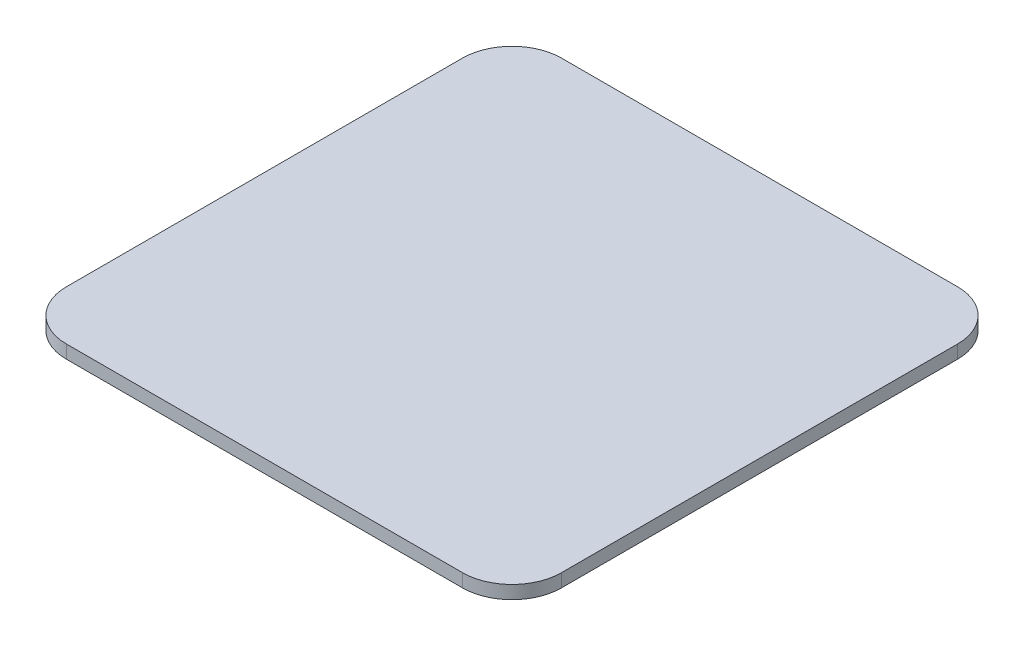
ISO-10303-21;
HEADER;
FILE_DESCRIPTION(('STEP AP214'),'2;1');
FILE_NAME('part.step','',(''),(''),'','','');
FILE_SCHEMA(('AUTOMOTIVE_DESIGN { 1 0 10303 214 1 1 1 1 }'));
ENDSEC;
DATA;
#1=APPLICATION_CONTEXT('core data for automotive mechanical design processes');
#2=APPLICATION_PROTOCOL_DEFINITION('international standard','automotive_design',2000,#1);
#3=PRODUCT_CONTEXT('',#1,'mechanical');
#4=PRODUCT('Part','Part','',(#3));
#5=PRODUCT_RELATED_PRODUCT_CATEGORY('part','',(#4));
#6=PRODUCT_DEFINITION_FORMATION('','',#4);
#7=PRODUCT_DEFINITION_CONTEXT('part definition',#1,'design');
#8=PRODUCT_DEFINITION('design','',#6,#7);
#9=PRODUCT_DEFINITION_SHAPE('','',#8);
#10=(LENGTH_UNIT() NAMED_UNIT(*) SI_UNIT(.MILLI.,.METRE.));
#11=(NAMED_UNIT(*) PLANE_ANGLE_UNIT() SI_UNIT($,.RADIAN.));
#12=(NAMED_UNIT(*) SI_UNIT($,.STERADIAN.) SOLID_ANGLE_UNIT());
#13=UNCERTAINTY_MEASURE_WITH_UNIT(LENGTH_MEASURE(1.E-05),#10,'distance_accuracy_value','');
#14=(GEOMETRIC_REPRESENTATION_CONTEXT(3) GLOBAL_UNCERTAINTY_ASSIGNED_CONTEXT((#13)) GLOBAL_UNIT_ASSIGNED_CONTEXT((#10,
#11,#12)) REPRESENTATION_CONTEXT('',''));
#15=CARTESIAN_POINT('',(0.,0.,0.));
#16=DIRECTION('',(0.,0.,1.));
#17=DIRECTION('',(1.,0.,0.));
#18=AXIS2_PLACEMENT_3D('',#15,#16,#17);
#19=CARTESIAN_POINT('',(75.,4.,0.));
#20=DIRECTION('',(-1.,0.,0.));
#21=DIRECTION('',(0.,0.,1.));
#22=AXIS2_PLACEMENT_3D('',#19,#20,#21);
#23=PLANE('',#22);
#24=DIRECTION('',(0.,0.,-1.));
#25=VECTOR('',#24,1.);
#26=CARTESIAN_POINT('',(75.,0.,0.));
#27=LINE('',#26,#25);
#28=CARTESIAN_POINT('',(75.,0.,60.));
#29=VERTEX_POINT('',#28);
#30=CARTESIAN_POINT('',(75.,0.,-60.));
#31=VERTEX_POINT('',#30);
#32=EDGE_CURVE('E147',#29,#31,#27,.T.);
#33=ORIENTED_EDGE('',*,*,#32,.T.);
#34=DIRECTION('',(0.,-1.,0.));
#35=VECTOR('',#34,1.);
#36=CARTESIAN_POINT('',(75.,4.,-60.));
#37=LINE('',#36,#35);
#38=CARTESIAN_POINT('',(75.,4.,-60.));
#39=VERTEX_POINT('',#38);
#40=EDGE_CURVE('E11',#39,#31,#37,.T.);
#41=ORIENTED_EDGE('',*,*,#40,.F.);
#42=DIRECTION('',(0.,0.,-1.));
#43=VECTOR('',#42,1.);
#44=CARTESIAN_POINT('',(75.,4.,0.));
#45=LINE('',#44,#43);
#46=CARTESIAN_POINT('',(75.,4.,60.));
#47=VERTEX_POINT('',#46);
#48=EDGE_CURVE('E175',#47,#39,#45,.T.);
#49=ORIENTED_EDGE('',*,*,#48,.F.);
#50=DIRECTION('',(0.,-1.,0.));
#51=VECTOR('',#50,1.);
#52=CARTESIAN_POINT('',(75.,4.,60.));
#53=LINE('',#52,#51);
#54=EDGE_CURVE('E62',#47,#29,#53,.T.);
#55=ORIENTED_EDGE('',*,*,#54,.T.);
#56=EDGE_LOOP('',(#33,#41,#49,#55));
#57=FACE_BOUND('',#56,.T.);
#58=ADVANCED_FACE('F45',(#57),#23,.F.);
#59=CARTESIAN_POINT('',(60.,4.,-60.));
#60=DIRECTION('',(0.,-1.,0.));
#61=DIRECTION('',(0.,0.,-1.));
#62=AXIS2_PLACEMENT_3D('',#59,#60,#61);
#63=CYLINDRICAL_SURFACE('',#62,15.);
#64=CARTESIAN_POINT('',(60.,0.,-60.));
#65=DIRECTION('',(0.,1.,0.));
#66=DIRECTION('',(0.,0.,1.));
#67=AXIS2_PLACEMENT_3D('',#64,#65,#66);
#68=CIRCLE('',#67,15.);
#69=CARTESIAN_POINT('',(60.,0.,-75.));
#70=VERTEX_POINT('',#69);
#71=EDGE_CURVE('E150',#31,#70,#68,.T.);
#72=ORIENTED_EDGE('',*,*,#71,.T.);
#73=DIRECTION('',(0.,-1.,0.));
#74=VECTOR('',#73,1.);
#75=CARTESIAN_POINT('',(60.,4.,-75.));
#76=LINE('',#75,#74);
#77=CARTESIAN_POINT('',(60.,4.,-75.));
#78=VERTEX_POINT('',#77);
#79=EDGE_CURVE('E54',#78,#70,#76,.T.);
#80=ORIENTED_EDGE('',*,*,#79,.F.);
#81=CARTESIAN_POINT('',(60.,4.,-60.));
#82=DIRECTION('',(0.,1.,0.));
#83=DIRECTION('',(0.,0.,1.));
#84=AXIS2_PLACEMENT_3D('',#81,#82,#83);
#85=CIRCLE('',#84,15.);
#86=EDGE_CURVE('E101',#39,#78,#85,.T.);
#87=ORIENTED_EDGE('',*,*,#86,.F.);
#88=ORIENTED_EDGE('',*,*,#40,.T.);
#89=EDGE_LOOP('',(#72,#80,#87,#88));
#90=FACE_BOUND('',#89,.T.);
#91=ADVANCED_FACE('F194',(#90),#63,.T.);
#92=CARTESIAN_POINT('',(0.,4.,-75.));
#93=DIRECTION('',(0.,0.,-1.));
#94=DIRECTION('',(-1.,0.,0.));
#95=AXIS2_PLACEMENT_3D('',#92,#93,#94);
#96=PLANE('',#95);
#97=DIRECTION('',(1.,0.,0.));
#98=VECTOR('',#97,1.);
#99=CARTESIAN_POINT('',(0.,0.,-75.));
#100=LINE('',#99,#98);
#101=CARTESIAN_POINT('',(-60.,0.,-75.));
#102=VERTEX_POINT('',#101);
#103=EDGE_CURVE('E154',#102,#70,#100,.T.);
#104=ORIENTED_EDGE('',*,*,#103,.F.);
#105=DIRECTION('',(0.,-1.,0.));
#106=VECTOR('',#105,1.);
#107=CARTESIAN_POINT('',(-60.,4.,-75.));
#108=LINE('',#107,#106);
#109=CARTESIAN_POINT('',(-60.,4.,-75.));
#110=VERTEX_POINT('',#109);
#111=EDGE_CURVE('E185',#110,#102,#108,.T.);
#112=ORIENTED_EDGE('',*,*,#111,.F.);
#113=DIRECTION('',(1.,0.,0.));
#114=VECTOR('',#113,1.);
#115=CARTESIAN_POINT('',(0.,4.,-75.));
#116=LINE('',#115,#114);
#117=EDGE_CURVE('E193',#110,#78,#116,.T.);
#118=ORIENTED_EDGE('',*,*,#117,.T.);
#119=ORIENTED_EDGE('',*,*,#79,.T.);
#120=EDGE_LOOP('',(#104,#112,#118,#119));
#121=FACE_BOUND('',#120,.T.);
#122=ADVANCED_FACE('F191',(#121),#96,.T.);
#123=CARTESIAN_POINT('',(-60.,4.,-60.));
#124=DIRECTION('',(0.,-1.,0.));
#125=DIRECTION('',(0.,0.,-1.));
#126=AXIS2_PLACEMENT_3D('',#123,#124,#125);
#127=CYLINDRICAL_SURFACE('',#126,15.);
#128=CARTESIAN_POINT('',(-60.,0.,-60.));
#129=DIRECTION('',(0.,1.,0.));
#130=DIRECTION('',(0.,0.,1.));
#131=AXIS2_PLACEMENT_3D('',#128,#129,#130);
#132=CIRCLE('',#131,15.);
#133=CARTESIAN_POINT('',(-75.,0.,-60.));
#134=VERTEX_POINT('',#133);
#135=EDGE_CURVE('E158',#134,#102,#132,.F.);
#136=ORIENTED_EDGE('',*,*,#135,.F.);
#137=DIRECTION('',(0.,-1.,0.));
#138=VECTOR('',#137,1.);
#139=CARTESIAN_POINT('',(-75.,4.,-60.));
#140=LINE('',#139,#138);
#141=CARTESIAN_POINT('',(-75.,4.,-60.));
#142=VERTEX_POINT('',#141);
#143=EDGE_CURVE('E182',#142,#134,#140,.T.);
#144=ORIENTED_EDGE('',*,*,#143,.F.);
#145=CARTESIAN_POINT('',(-60.,4.,-60.));
#146=DIRECTION('',(0.,1.,0.));
#147=DIRECTION('',(0.,0.,1.));
#148=AXIS2_PLACEMENT_3D('',#145,#146,#147);
#149=CIRCLE('',#148,15.);
#150=EDGE_CURVE('E203',#142,#110,#149,.F.);
#151=ORIENTED_EDGE('',*,*,#150,.T.);
#152=ORIENTED_EDGE('',*,*,#111,.T.);
#153=EDGE_LOOP('',(#136,#144,#151,#152));
#154=FACE_BOUND('',#153,.T.);
#155=ADVANCED_FACE('F201',(#154),#127,.T.);
#156=CARTESIAN_POINT('',(-75.,4.,0.));
#157=DIRECTION('',(-1.,0.,0.));
#158=DIRECTION('',(0.,0.,1.));
#159=AXIS2_PLACEMENT_3D('',#156,#157,#158);
#160=PLANE('',#159);
#161=DIRECTION('',(0.,0.,-1.));
#162=VECTOR('',#161,1.);
#163=CARTESIAN_POINT('',(-75.,0.,0.));
#164=LINE('',#163,#162);
#165=CARTESIAN_POINT('',(-75.,0.,60.));
#166=VERTEX_POINT('',#165);
#167=EDGE_CURVE('E162',#166,#134,#164,.T.);
#168=ORIENTED_EDGE('',*,*,#167,.F.);
#169=DIRECTION('',(0.,-1.,0.));
#170=VECTOR('',#169,1.);
#171=CARTESIAN_POINT('',(-75.,4.,60.));
#172=LINE('',#171,#170);
#173=CARTESIAN_POINT('',(-75.,4.,60.));
#174=VERTEX_POINT('',#173);
#175=EDGE_CURVE('E137',#174,#166,#172,.T.);
#176=ORIENTED_EDGE('',*,*,#175,.F.);
#177=DIRECTION('',(0.,0.,-1.));
#178=VECTOR('',#177,1.);
#179=CARTESIAN_POINT('',(-75.,4.,0.));
#180=LINE('',#179,#178);
#181=EDGE_CURVE('E125',#174,#142,#180,.T.);
#182=ORIENTED_EDGE('',*,*,#181,.T.);
#183=ORIENTED_EDGE('',*,*,#143,.T.);
#184=EDGE_LOOP('',(#168,#176,#182,#183));
#185=FACE_BOUND('',#184,.T.);
#186=ADVANCED_FACE('F213',(#185),#160,.T.);
#187=CARTESIAN_POINT('',(-60.,4.,60.));
#188=DIRECTION('',(0.,-1.,0.));
#189=DIRECTION('',(0.,0.,-1.));
#190=AXIS2_PLACEMENT_3D('',#187,#188,#189);
#191=CYLINDRICAL_SURFACE('',#190,15.);
#192=CARTESIAN_POINT('',(-60.,0.,60.));
#193=DIRECTION('',(0.,1.,0.));
#194=DIRECTION('',(0.,0.,1.));
#195=AXIS2_PLACEMENT_3D('',#192,#193,#194);
#196=CIRCLE('',#195,15.);
#197=CARTESIAN_POINT('',(-60.,0.,75.));
#198=VERTEX_POINT('',#197);
#199=EDGE_CURVE('E133',#166,#198,#196,.T.);
#200=ORIENTED_EDGE('',*,*,#199,.T.);
#201=DIRECTION('',(0.,-1.,0.));
#202=VECTOR('',#201,1.);
#203=CARTESIAN_POINT('',(-60.,4.,75.));
#204=LINE('',#203,#202);
#205=CARTESIAN_POINT('',(-60.,4.,75.));
#206=VERTEX_POINT('',#205);
#207=EDGE_CURVE('E130',#206,#198,#204,.T.);
#208=ORIENTED_EDGE('',*,*,#207,.F.);
#209=CARTESIAN_POINT('',(-60.,4.,60.));
#210=DIRECTION('',(0.,1.,0.));
#211=DIRECTION('',(0.,0.,1.));
#212=AXIS2_PLACEMENT_3D('',#209,#210,#211);
#213=CIRCLE('',#212,15.);
#214=EDGE_CURVE('E117',#174,#206,#213,.T.);
#215=ORIENTED_EDGE('',*,*,#214,.F.);
#216=ORIENTED_EDGE('',*,*,#175,.T.);
#217=EDGE_LOOP('',(#200,#208,#215,#216));
#218=FACE_BOUND('',#217,.T.);
#219=ADVANCED_FACE('F131',(#218),#191,.T.);
#220=CARTESIAN_POINT('',(0.,4.,75.));
#221=DIRECTION('',(0.,0.,-1.));
#222=DIRECTION('',(-1.,0.,0.));
#223=AXIS2_PLACEMENT_3D('',#220,#221,#222);
#224=PLANE('',#223);
#225=DIRECTION('',(1.,0.,0.));
#226=VECTOR('',#225,1.);
#227=CARTESIAN_POINT('',(0.,0.,75.));
#228=LINE('',#227,#226);
#229=CARTESIAN_POINT('',(60.,0.,75.));
#230=VERTEX_POINT('',#229);
#231=EDGE_CURVE('E168',#198,#230,#228,.T.);
#232=ORIENTED_EDGE('',*,*,#231,.T.);
#233=DIRECTION('',(0.,-1.,0.));
#234=VECTOR('',#233,1.);
#235=CARTESIAN_POINT('',(60.,4.,75.));
#236=LINE('',#235,#234);
#237=CARTESIAN_POINT('',(60.,4.,75.));
#238=VERTEX_POINT('',#237);
#239=EDGE_CURVE('E89',#238,#230,#236,.T.);
#240=ORIENTED_EDGE('',*,*,#239,.F.);
#241=DIRECTION('',(1.,0.,0.));
#242=VECTOR('',#241,1.);
#243=CARTESIAN_POINT('',(0.,4.,75.));
#244=LINE('',#243,#242);
#245=EDGE_CURVE('E122',#206,#238,#244,.T.);
#246=ORIENTED_EDGE('',*,*,#245,.F.);
#247=ORIENTED_EDGE('',*,*,#207,.T.);
#248=EDGE_LOOP('',(#232,#240,#246,#247));
#249=FACE_BOUND('',#248,.T.);
#250=ADVANCED_FACE('F139',(#249),#224,.F.);
#251=CARTESIAN_POINT('',(60.,4.,60.));
#252=DIRECTION('',(0.,-1.,0.));
#253=DIRECTION('',(0.,0.,-1.));
#254=AXIS2_PLACEMENT_3D('',#251,#252,#253);
#255=CYLINDRICAL_SURFACE('',#254,15.);
#256=CARTESIAN_POINT('',(60.,0.,60.));
#257=DIRECTION('',(0.,1.,0.));
#258=DIRECTION('',(0.,0.,1.));
#259=AXIS2_PLACEMENT_3D('',#256,#257,#258);
#260=CIRCLE('',#259,15.);
#261=EDGE_CURVE('E171',#29,#230,#260,.F.);
#262=ORIENTED_EDGE('',*,*,#261,.F.);
#263=ORIENTED_EDGE('',*,*,#54,.F.);
#264=CARTESIAN_POINT('',(60.,4.,60.));
#265=DIRECTION('',(0.,1.,0.));
#266=DIRECTION('',(0.,0.,1.));
#267=AXIS2_PLACEMENT_3D('',#264,#265,#266);
#268=CIRCLE('',#267,15.);
#269=EDGE_CURVE('E141',#47,#238,#268,.F.);
#270=ORIENTED_EDGE('',*,*,#269,.T.);
#271=ORIENTED_EDGE('',*,*,#239,.T.);
#272=EDGE_LOOP('',(#262,#263,#270,#271));
#273=FACE_BOUND('',#272,.T.);
#274=ADVANCED_FACE('F214',(#273),#255,.T.);
#275=CARTESIAN_POINT('',(0.,4.,0.));
#276=DIRECTION('',(0.,1.,0.));
#277=DIRECTION('',(0.,0.,1.));
#278=AXIS2_PLACEMENT_3D('',#275,#276,#277);
#279=PLANE('',#278);
#280=ORIENTED_EDGE('',*,*,#48,.T.);
#281=ORIENTED_EDGE('',*,*,#86,.T.);
#282=ORIENTED_EDGE('',*,*,#117,.F.);
#283=ORIENTED_EDGE('',*,*,#150,.F.);
#284=ORIENTED_EDGE('',*,*,#181,.F.);
#285=ORIENTED_EDGE('',*,*,#214,.T.);
#286=ORIENTED_EDGE('',*,*,#245,.T.);
#287=ORIENTED_EDGE('',*,*,#269,.F.);
#288=EDGE_LOOP('',(#280,#281,#282,#283,#284,#285,#286,#287));
#289=FACE_BOUND('',#288,.T.);
#290=ADVANCED_FACE('F119',(#289),#279,.T.);
#291=CARTESIAN_POINT('',(0.,0.,0.));
#292=DIRECTION('',(0.,1.,0.));
#293=DIRECTION('',(0.,0.,1.));
#294=AXIS2_PLACEMENT_3D('',#291,#292,#293);
#295=PLANE('',#294);
#296=ORIENTED_EDGE('',*,*,#32,.F.);
#297=ORIENTED_EDGE('',*,*,#261,.T.);
#298=ORIENTED_EDGE('',*,*,#231,.F.);
#299=ORIENTED_EDGE('',*,*,#199,.F.);
#300=ORIENTED_EDGE('',*,*,#167,.T.);
#301=ORIENTED_EDGE('',*,*,#135,.T.);
#302=ORIENTED_EDGE('',*,*,#103,.T.);
#303=ORIENTED_EDGE('',*,*,#71,.F.);
#304=EDGE_LOOP('',(#296,#297,#298,#299,#300,#301,#302,#303));
#305=FACE_BOUND('',#304,.T.);
#306=ADVANCED_FACE('F197',(#305),#295,.F.);
#307=CLOSED_SHELL('',(#58,#91,#122,#155,#186,#219,#250,#274,#290,#306));
#308=MANIFOLD_SOLID_BREP('B2',#307);
#309=ADVANCED_BREP_SHAPE_REPRESENTATION('',(#18,#308),#14);
#310=SHAPE_DEFINITION_REPRESENTATION(#9,#309);
ENDSEC;
END-ISO-10303-21;
